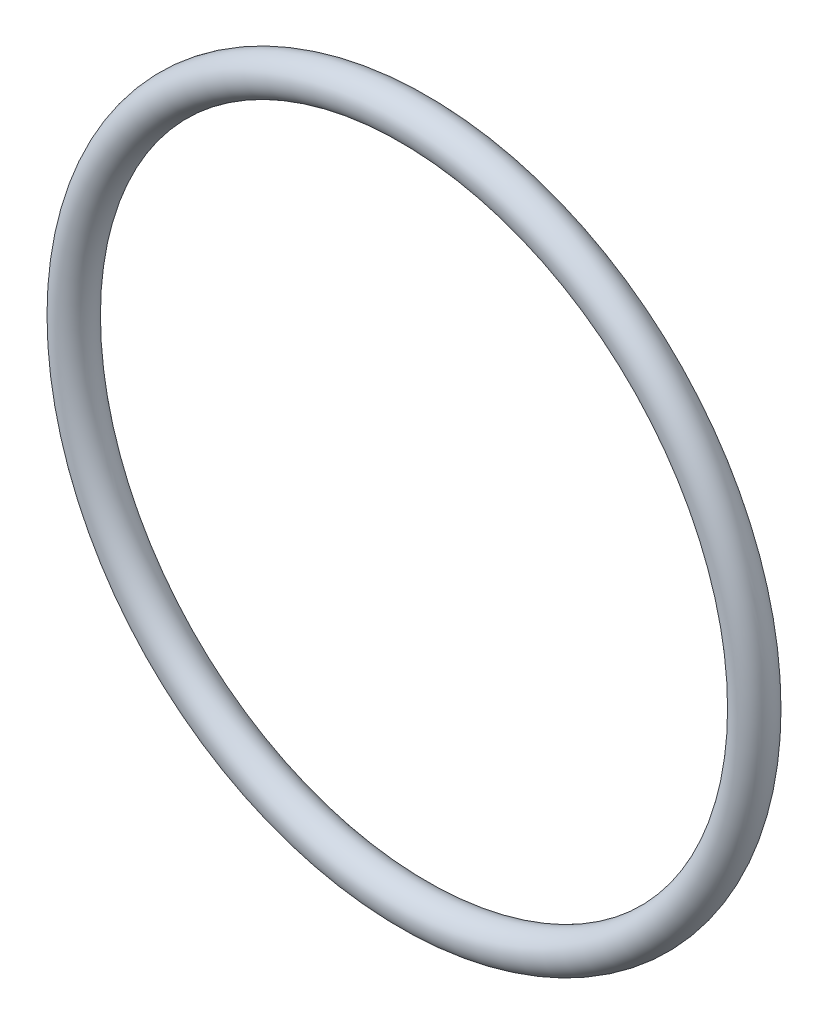
ISO-10303-21;
HEADER;
FILE_DESCRIPTION(('STEP AP214'),'2;1');
FILE_NAME('part.step','',(''),(''),'','','');
FILE_SCHEMA(('AUTOMOTIVE_DESIGN { 1 0 10303 214 1 1 1 1 }'));
ENDSEC;
DATA;
#1=APPLICATION_CONTEXT('core data for automotive mechanical design processes');
#2=APPLICATION_PROTOCOL_DEFINITION('international standard','automotive_design',2000,#1);
#3=PRODUCT_CONTEXT('',#1,'mechanical');
#4=PRODUCT('Part','Part','',(#3));
#5=PRODUCT_RELATED_PRODUCT_CATEGORY('part','',(#4));
#6=PRODUCT_DEFINITION_FORMATION('','',#4);
#7=PRODUCT_DEFINITION_CONTEXT('part definition',#1,'design');
#8=PRODUCT_DEFINITION('design','',#6,#7);
#9=PRODUCT_DEFINITION_SHAPE('','',#8);
#10=(LENGTH_UNIT() NAMED_UNIT(*) SI_UNIT(.MILLI.,.METRE.));
#11=(NAMED_UNIT(*) PLANE_ANGLE_UNIT() SI_UNIT($,.RADIAN.));
#12=(NAMED_UNIT(*) SI_UNIT($,.STERADIAN.) SOLID_ANGLE_UNIT());
#13=UNCERTAINTY_MEASURE_WITH_UNIT(LENGTH_MEASURE(1.E-05),#10,'distance_accuracy_value','');
#14=(GEOMETRIC_REPRESENTATION_CONTEXT(3) GLOBAL_UNCERTAINTY_ASSIGNED_CONTEXT((#13)) GLOBAL_UNIT_ASSIGNED_CONTEXT((#10,
#11,#12)) REPRESENTATION_CONTEXT('',''));
#15=CARTESIAN_POINT('',(0.,0.,0.));
#16=DIRECTION('',(0.,0.,1.));
#17=DIRECTION('',(1.,0.,0.));
#18=AXIS2_PLACEMENT_3D('',#15,#16,#17);
#19=CARTESIAN_POINT('',(900.,0.,0.));
#20=DIRECTION('',(0.,0.,1.));
#21=DIRECTION('',(1.,0.,0.));
#22=AXIS2_PLACEMENT_3D('',#19,#20,#21);
#23=TOROIDAL_SURFACE('',#22,900.,50.);
#24=CARTESIAN_POINT('',(0.,0.,0.));
#25=DIRECTION('',(0.,1.,0.));
#26=DIRECTION('',(0.,0.,1.));
#27=AXIS2_PLACEMENT_3D('',#24,#25,#26);
#28=CIRCLE('',#27,50.);
#29=CARTESIAN_POINT('',(-50.,0.,0.));
#30=VERTEX_POINT('',#29);
#31=EDGE_CURVE('E35',#30,#30,#28,.T.);
#32=CARTESIAN_POINT('',(900.,0.,0.));
#33=DIRECTION('',(0.,0.,1.));
#34=DIRECTION('',(1.,0.,0.));
#35=AXIS2_PLACEMENT_3D('',#32,#33,#34);
#36=CIRCLE('',#35,950.);
#37=EDGE_CURVE('',#30,#30,#36,.T.);
#38=ORIENTED_EDGE('',*,*,#31,.F.);
#39=ORIENTED_EDGE('',*,*,#31,.T.);
#40=ORIENTED_EDGE('',*,*,#37,.T.);
#41=ORIENTED_EDGE('',*,*,#37,.F.);
#42=EDGE_LOOP('',(#38,#40,#39,#41));
#43=FACE_BOUND('',#42,.T.);
#44=ADVANCED_FACE('F32',(#43),#23,.T.);
#45=CLOSED_SHELL('',(#44));
#46=CARTESIAN_POINT('',(900.,0.,0.));
#47=DIRECTION('',(0.,0.,1.));
#48=DIRECTION('',(1.,0.,0.));
#49=AXIS2_PLACEMENT_3D('',#46,#47,#48);
#50=TOROIDAL_SURFACE('',#49,900.,35.);
#51=CARTESIAN_POINT('',(0.,0.,0.));
#52=DIRECTION('',(0.,1.,0.));
#53=DIRECTION('',(0.,0.,1.));
#54=AXIS2_PLACEMENT_3D('',#51,#52,#53);
#55=CIRCLE('',#54,35.);
#56=CARTESIAN_POINT('',(-35.,0.,0.));
#57=VERTEX_POINT('',#56);
#58=EDGE_CURVE('E10',#57,#57,#55,.F.);
#59=CARTESIAN_POINT('',(900.,0.,0.));
#60=DIRECTION('',(0.,0.,1.));
#61=DIRECTION('',(1.,0.,0.));
#62=AXIS2_PLACEMENT_3D('',#59,#60,#61);
#63=CIRCLE('',#62,935.);
#64=EDGE_CURVE('',#57,#57,#63,.T.);
#65=ORIENTED_EDGE('',*,*,#58,.F.);
#66=ORIENTED_EDGE('',*,*,#58,.T.);
#67=ORIENTED_EDGE('',*,*,#64,.T.);
#68=ORIENTED_EDGE('',*,*,#64,.F.);
#69=EDGE_LOOP('',(#65,#67,#66,#68));
#70=FACE_BOUND('',#69,.T.);
#71=ADVANCED_FACE('F52',(#70),#50,.F.);
#72=CLOSED_SHELL('',(#71));
#73=ORIENTED_CLOSED_SHELL('',*,#72,.T.);
#74=BREP_WITH_VOIDS('B2',#45,(#73));
#75=ADVANCED_BREP_SHAPE_REPRESENTATION('',(#18,#74),#14);
#76=SHAPE_DEFINITION_REPRESENTATION(#9,#75);
ENDSEC;
END-ISO-10303-21;
